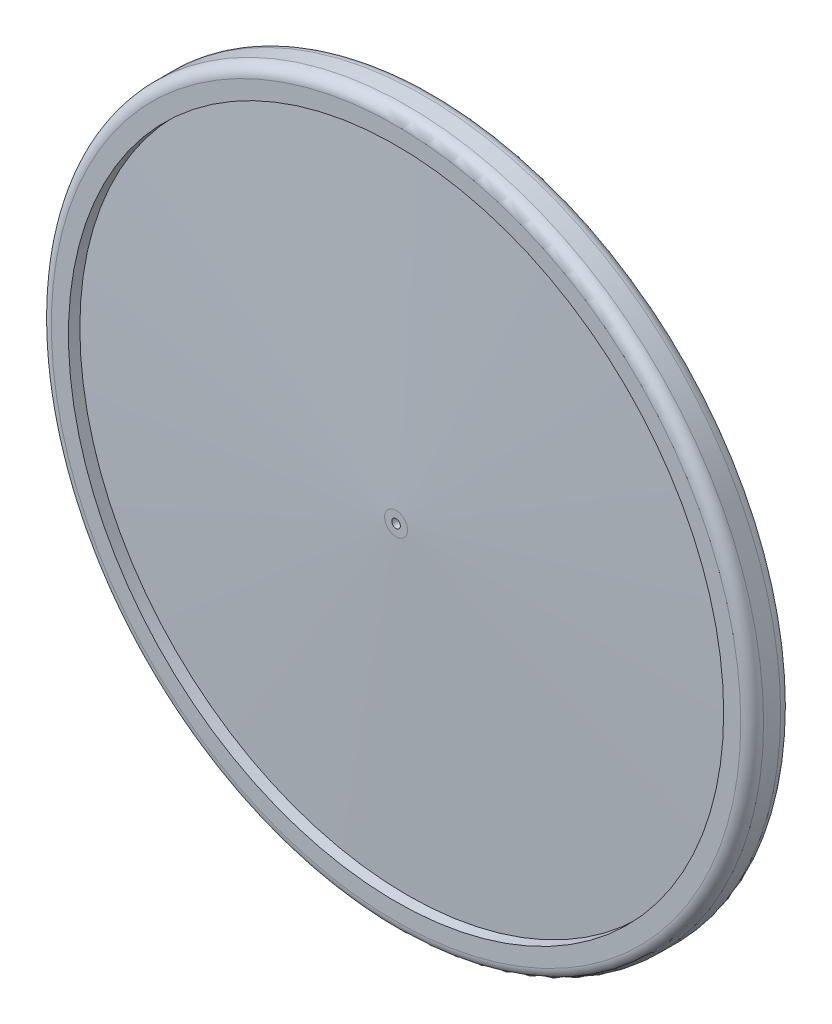
ISO-10303-21;
HEADER;
FILE_DESCRIPTION(('STEP AP214'),'2;1');
FILE_NAME('part.step','',(''),(''),'','','');
FILE_SCHEMA(('AUTOMOTIVE_DESIGN { 1 0 10303 214 1 1 1 1 }'));
ENDSEC;
DATA;
#1=APPLICATION_CONTEXT('core data for automotive mechanical design processes');
#2=APPLICATION_PROTOCOL_DEFINITION('international standard','automotive_design',2000,#1);
#3=PRODUCT_CONTEXT('',#1,'mechanical');
#4=PRODUCT('Part','Part','',(#3));
#5=PRODUCT_RELATED_PRODUCT_CATEGORY('part','',(#4));
#6=PRODUCT_DEFINITION_FORMATION('','',#4);
#7=PRODUCT_DEFINITION_CONTEXT('part definition',#1,'design');
#8=PRODUCT_DEFINITION('design','',#6,#7);
#9=PRODUCT_DEFINITION_SHAPE('','',#8);
#10=(LENGTH_UNIT() NAMED_UNIT(*) SI_UNIT(.MILLI.,.METRE.));
#11=(NAMED_UNIT(*) PLANE_ANGLE_UNIT() SI_UNIT($,.RADIAN.));
#12=(NAMED_UNIT(*) SI_UNIT($,.STERADIAN.) SOLID_ANGLE_UNIT());
#13=UNCERTAINTY_MEASURE_WITH_UNIT(LENGTH_MEASURE(1.E-05),#10,'distance_accuracy_value','');
#14=(GEOMETRIC_REPRESENTATION_CONTEXT(3) GLOBAL_UNCERTAINTY_ASSIGNED_CONTEXT((#13)) GLOBAL_UNIT_ASSIGNED_CONTEXT((#10,
#11,#12)) REPRESENTATION_CONTEXT('',''));
#15=CARTESIAN_POINT('',(0.,0.,0.));
#16=DIRECTION('',(0.,0.,1.));
#17=DIRECTION('',(1.,0.,0.));
#18=AXIS2_PLACEMENT_3D('',#15,#16,#17);
#19=CARTESIAN_POINT('',(0.,0.,17.5));
#20=DIRECTION('',(0.,0.,1.));
#21=DIRECTION('',(1.,0.,0.));
#22=AXIS2_PLACEMENT_3D('',#19,#20,#21);
#23=CYLINDRICAL_SURFACE('',#22,287.5);
#24=CARTESIAN_POINT('',(0.,0.,-7.49999999999999));
#25=DIRECTION('',(0.,0.,1.));
#26=DIRECTION('',(1.,0.,0.));
#27=AXIS2_PLACEMENT_3D('',#24,#25,#26);
#28=CIRCLE('',#27,287.5);
#29=CARTESIAN_POINT('',(287.5,0.,-7.5));
#30=VERTEX_POINT('',#29);
#31=EDGE_CURVE('E10',#30,#30,#28,.T.);
#32=ORIENTED_EDGE('',*,*,#31,.T.);
#33=EDGE_LOOP('',(#32));
#34=FACE_BOUND('',#33,.T.);
#35=CARTESIAN_POINT('',(0.,0.,-17.5));
#36=DIRECTION('',(0.,0.,1.));
#37=DIRECTION('',(1.,0.,0.));
#38=AXIS2_PLACEMENT_3D('',#35,#36,#37);
#39=CIRCLE('',#38,287.5);
#40=CARTESIAN_POINT('',(287.5,0.,-17.5));
#41=VERTEX_POINT('',#40);
#42=EDGE_CURVE('E80',#41,#41,#39,.T.);
#43=ORIENTED_EDGE('',*,*,#42,.F.);
#44=EDGE_LOOP('',(#43));
#45=FACE_BOUND('',#44,.T.);
#46=ADVANCED_FACE('F37',(#34,#45),#23,.F.);
#47=CARTESIAN_POINT('',(0.,0.,-7.49999999999999));
#48=DIRECTION('',(0.,0.,1.));
#49=DIRECTION('',(1.,0.,0.));
#50=AXIS2_PLACEMENT_3D('',#47,#48,#49);
#51=CONICAL_SURFACE('',#50,287.5,1.53477222202823);
#52=CARTESIAN_POINT('',(0.,0.,-17.5));
#53=DIRECTION('',(0.,0.,1.));
#54=DIRECTION('',(1.,0.,0.));
#55=AXIS2_PLACEMENT_3D('',#52,#53,#54);
#56=CIRCLE('',#55,10.0281820778356);
#57=CARTESIAN_POINT('',(10.0281820778348,0.,-17.5));
#58=VERTEX_POINT('',#57);
#59=EDGE_CURVE('E44',#58,#58,#56,.T.);
#60=CARTESIAN_POINT('',(10.0281820778348,0.,-17.5));
#61=CARTESIAN_POINT('',(12.9185135145241,0.,-17.3958333333333));
#62=CARTESIAN_POINT('',(15.8088449512133,0.,-17.2916666666667));
#63=CARTESIAN_POINT('',(21.5895078245917,0.,-17.0833333333333));
#64=CARTESIAN_POINT('',(24.4798392612809,0.,-16.9791666666667));
#65=CARTESIAN_POINT('',(30.2605021346594,0.,-16.7708333333333));
#66=CARTESIAN_POINT('',(33.1508335713486,0.,-16.6666666666667));
#67=CARTESIAN_POINT('',(38.931496444727,0.,-16.4583333333333));
#68=CARTESIAN_POINT('',(41.8218278814162,0.,-16.3541666666667));
#69=CARTESIAN_POINT('',(47.6024907547947,0.,-16.1458333333333));
#70=CARTESIAN_POINT('',(50.4928221914839,0.,-16.0416666666667));
#71=CARTESIAN_POINT('',(56.2734850648623,0.,-15.8333333333333));
#72=CARTESIAN_POINT('',(59.1638165015516,0.,-15.7291666666667));
#73=CARTESIAN_POINT('',(64.94447937493,0.,-15.5208333333333));
#74=CARTESIAN_POINT('',(67.8348108116192,0.,-15.4166666666667));
#75=CARTESIAN_POINT('',(73.6154736849977,0.,-15.2083333333333));
#76=CARTESIAN_POINT('',(76.5058051216869,0.,-15.1041666666667));
#77=CARTESIAN_POINT('',(82.2864679950654,0.,-14.8958333333333));
#78=CARTESIAN_POINT('',(85.1767994317546,0.,-14.7916666666667));
#79=CARTESIAN_POINT('',(90.957462305133,0.,-14.5833333333333));
#80=CARTESIAN_POINT('',(93.8477937418222,0.,-14.4791666666667));
#81=CARTESIAN_POINT('',(99.6284566152007,0.,-14.2708333333333));
#82=CARTESIAN_POINT('',(102.51878805189,0.,-14.1666666666667));
#83=CARTESIAN_POINT('',(108.299450925268,0.,-13.9583333333333));
#84=CARTESIAN_POINT('',(111.189782361958,0.,-13.8541666666667));
#85=CARTESIAN_POINT('',(116.970445235336,0.,-13.6458333333333));
#86=CARTESIAN_POINT('',(119.860776672025,0.,-13.5416666666667));
#87=CARTESIAN_POINT('',(125.641439545404,0.,-13.3333333333333));
#88=CARTESIAN_POINT('',(128.531770982093,0.,-13.2291666666667));
#89=CARTESIAN_POINT('',(134.312433855471,0.,-13.0208333333333));
#90=CARTESIAN_POINT('',(137.202765292161,0.,-12.9166666666667));
#91=CARTESIAN_POINT('',(142.983428165539,0.,-12.7083333333333));
#92=CARTESIAN_POINT('',(145.873759602228,0.,-12.6041666666667));
#93=CARTESIAN_POINT('',(151.654422475607,0.,-12.3958333333333));
#94=CARTESIAN_POINT('',(154.544753912296,0.,-12.2916666666667));
#95=CARTESIAN_POINT('',(160.325416785674,0.,-12.0833333333333));
#96=CARTESIAN_POINT('',(163.215748222364,0.,-11.9791666666667));
#97=CARTESIAN_POINT('',(168.996411095742,0.,-11.7708333333333));
#98=CARTESIAN_POINT('',(171.886742532431,0.,-11.6666666666667));
#99=CARTESIAN_POINT('',(177.66740540581,0.,-11.4583333333333));
#100=CARTESIAN_POINT('',(180.557736842499,0.,-11.3541666666667));
#101=CARTESIAN_POINT('',(186.338399715877,0.,-11.1458333333333));
#102=CARTESIAN_POINT('',(189.228731152566,0.,-11.0416666666667));
#103=CARTESIAN_POINT('',(195.009394025945,0.,-10.8333333333333));
#104=CARTESIAN_POINT('',(197.899725462634,0.,-10.7291666666667));
#105=CARTESIAN_POINT('',(203.680388336013,0.,-10.5208333333333));
#106=CARTESIAN_POINT('',(206.570719772702,0.,-10.4166666666667));
#107=CARTESIAN_POINT('',(212.35138264608,0.,-10.2083333333333));
#108=CARTESIAN_POINT('',(215.241714082769,0.,-10.1041666666667));
#109=CARTESIAN_POINT('',(221.022376956148,0.,-9.89583333333333));
#110=CARTESIAN_POINT('',(223.912708392837,0.,-9.79166666666667));
#111=CARTESIAN_POINT('',(229.693371266216,0.,-9.58333333333333));
#112=CARTESIAN_POINT('',(232.583702702905,0.,-9.47916666666667));
#113=CARTESIAN_POINT('',(238.364365576283,0.,-9.27083333333333));
#114=CARTESIAN_POINT('',(241.254697012972,0.,-9.16666666666667));
#115=CARTESIAN_POINT('',(247.035359886351,0.,-8.95833333333334));
#116=CARTESIAN_POINT('',(249.92569132304,0.,-8.85416666666667));
#117=CARTESIAN_POINT('',(255.706354196419,0.,-8.64583333333334));
#118=CARTESIAN_POINT('',(258.596685633108,0.,-8.54166666666667));
#119=CARTESIAN_POINT('',(264.377348506486,0.,-8.33333333333334));
#120=CARTESIAN_POINT('',(267.267679943175,0.,-8.22916666666667));
#121=CARTESIAN_POINT('',(273.048342816554,0.,-8.02083333333334));
#122=CARTESIAN_POINT('',(275.938674253243,0.,-7.91666666666667));
#123=CARTESIAN_POINT('',(281.719337126621,0.,-7.70833333333334));
#124=CARTESIAN_POINT('',(284.609668563311,0.,-7.60416666666667));
#125=CARTESIAN_POINT('',(287.5,0.,-7.5));
#126=B_SPLINE_CURVE_WITH_KNOTS('',3,(#60,#61,#62,#63,#64,#65,#66,#67,#68,#69,#70,#71,#72,#73,
#74,#75,#76,#77,#78,#79,#80,#81,#82,#83,#84,#85,#86,#87,#88,#89,#90,#91,#92,#93,#94,#95,#96,#97,
#98,#99,#100,#101,#102,#103,#104,#105,#106,#107,#108,#109,#110,#111,#112,#113,#114,#115,#116,
#117,#118,#119,#120,#121,#122,#123,#124,#125),.UNSPECIFIED.,.F.,.F.,(4,2,2,2,2,2,2,2,2,2,2,2,2,
2,2,2,2,2,2,2,2,2,2,2,2,2,2,2,2,2,2,2,4),(0.,8.67662368523755,17.3532473704751,26.0298710557127,
34.7064947409503,43.3831184261879,52.0597421114254,60.736365796663,69.4129894819006,
78.0896131671382,86.7662368523758,95.4428605376134,104.119484222851,112.796107908089,
121.472731593326,130.149355278564,138.825978963801,147.502602649039,156.179226334276,
164.855850019514,173.532473704752,182.209097389989,190.885721075227,199.562344760464,
208.238968445702,216.91559213094,225.592215816177,234.268839501415,242.945463186652,
251.62208687189,260.298710557127,268.975334242365,277.651957927603),.UNSPECIFIED.);
#127=EDGE_CURVE('BSEAM114',#58,#30,#126,.T.);
#128=ORIENTED_EDGE('',*,*,#59,.T.);
#129=ORIENTED_EDGE('',*,*,#31,.F.);
#130=ORIENTED_EDGE('',*,*,#127,.T.);
#131=ORIENTED_EDGE('',*,*,#127,.F.);
#132=EDGE_LOOP('',(#128,#130,#129,#131));
#133=FACE_BOUND('',#132,.T.);
#134=ADVANCED_FACE('F114',(#133),#51,.T.);
#135=CARTESIAN_POINT('',(0.,0.,-17.5));
#136=DIRECTION('',(0.,0.,-1.));
#137=DIRECTION('',(-1.,0.,0.));
#138=AXIS2_PLACEMENT_3D('',#135,#136,#137);
#139=PLANE('',#138);
#140=CARTESIAN_POINT('',(0.,0.,-17.5));
#141=DIRECTION('',(0.,0.,-1.));
#142=DIRECTION('',(-1.,0.,0.));
#143=AXIS2_PLACEMENT_3D('',#140,#141,#142);
#144=CIRCLE('',#143,3.75);
#145=CARTESIAN_POINT('',(-3.75,0.,-17.5));
#146=VERTEX_POINT('',#145);
#147=EDGE_CURVE('E84',#146,#146,#144,.T.);
#148=ORIENTED_EDGE('',*,*,#147,.F.);
#149=EDGE_LOOP('',(#148));
#150=FACE_BOUND('',#149,.T.);
#151=ORIENTED_EDGE('',*,*,#59,.F.);
#152=EDGE_LOOP('',(#151));
#153=FACE_BOUND('',#152,.T.);
#154=ADVANCED_FACE('F99',(#150,#153),#139,.T.);
#155=CARTESIAN_POINT('',(10.0281820778356,0.,17.5));
#156=DIRECTION('',(0.,0.,1.));
#157=DIRECTION('',(1.,0.,0.));
#158=AXIS2_PLACEMENT_3D('',#155,#156,#157);
#159=PLANE('',#158);
#160=CARTESIAN_POINT('',(0.,0.,17.5));
#161=DIRECTION('',(0.,0.,1.));
#162=DIRECTION('',(1.,0.,0.));
#163=AXIS2_PLACEMENT_3D('',#160,#161,#162);
#164=CIRCLE('',#163,3.75);
#165=CARTESIAN_POINT('',(3.75,0.,17.5));
#166=VERTEX_POINT('',#165);
#167=EDGE_CURVE('E88',#166,#166,#164,.T.);
#168=ORIENTED_EDGE('',*,*,#167,.F.);
#169=EDGE_LOOP('',(#168));
#170=FACE_BOUND('',#169,.T.);
#171=CARTESIAN_POINT('',(0.,0.,17.5));
#172=DIRECTION('',(0.,0.,1.));
#173=DIRECTION('',(1.,0.,0.));
#174=AXIS2_PLACEMENT_3D('',#171,#172,#173);
#175=CIRCLE('',#174,10.0281820778356);
#176=CARTESIAN_POINT('',(-10.0281820778356,0.,17.5));
#177=VERTEX_POINT('',#176);
#178=EDGE_CURVE('E49',#177,#177,#175,.T.);
#179=ORIENTED_EDGE('',*,*,#178,.T.);
#180=EDGE_LOOP('',(#179));
#181=FACE_BOUND('',#180,.T.);
#182=ADVANCED_FACE('F95',(#170,#181),#159,.T.);
#183=CARTESIAN_POINT('',(0.,0.,17.5));
#184=DIRECTION('',(0.,0.,-1.));
#185=DIRECTION('',(-1.,0.,0.));
#186=AXIS2_PLACEMENT_3D('',#183,#184,#185);
#187=CONICAL_SURFACE('',#186,10.0281820778356,1.53477222202823);
#188=CARTESIAN_POINT('',(0.,0.,7.50000000000002));
#189=DIRECTION('',(0.,0.,1.));
#190=DIRECTION('',(1.,0.,0.));
#191=AXIS2_PLACEMENT_3D('',#188,#189,#190);
#192=CIRCLE('',#191,287.5);
#193=CARTESIAN_POINT('',(-287.5,0.,7.50000000000003));
#194=VERTEX_POINT('',#193);
#195=EDGE_CURVE('E54',#194,#194,#192,.T.);
#196=CARTESIAN_POINT('',(-287.5,0.,7.50000000000003));
#197=CARTESIAN_POINT('',(-284.609668563311,0.,7.6041666666667));
#198=CARTESIAN_POINT('',(-281.719337126622,0.,7.70833333333337));
#199=CARTESIAN_POINT('',(-275.938674253243,0.,7.9166666666667));
#200=CARTESIAN_POINT('',(-273.048342816554,0.,8.02083333333336));
#201=CARTESIAN_POINT('',(-267.267679943175,0.,8.2291666666667));
#202=CARTESIAN_POINT('',(-264.377348506486,0.,8.33333333333336));
#203=CARTESIAN_POINT('',(-258.596685633108,0.,8.5416666666667));
#204=CARTESIAN_POINT('',(-255.706354196419,0.,8.64583333333336));
#205=CARTESIAN_POINT('',(-249.92569132304,0.,8.85416666666669));
#206=CARTESIAN_POINT('',(-247.035359886351,0.,8.95833333333336));
#207=CARTESIAN_POINT('',(-241.254697012973,0.,9.16666666666669));
#208=CARTESIAN_POINT('',(-238.364365576283,0.,9.27083333333336));
#209=CARTESIAN_POINT('',(-232.583702702905,0.,9.47916666666669));
#210=CARTESIAN_POINT('',(-229.693371266216,0.,9.58333333333336));
#211=CARTESIAN_POINT('',(-223.912708392837,0.,9.79166666666669));
#212=CARTESIAN_POINT('',(-221.022376956148,0.,9.89583333333336));
#213=CARTESIAN_POINT('',(-215.24171408277,0.,10.1041666666667));
#214=CARTESIAN_POINT('',(-212.35138264608,0.,10.2083333333334));
#215=CARTESIAN_POINT('',(-206.570719772702,0.,10.4166666666667));
#216=CARTESIAN_POINT('',(-203.680388336013,0.,10.5208333333334));
#217=CARTESIAN_POINT('',(-197.899725462634,0.,10.7291666666667));
#218=CARTESIAN_POINT('',(-195.009394025945,0.,10.8333333333334));
#219=CARTESIAN_POINT('',(-189.228731152567,0.,11.0416666666667));
#220=CARTESIAN_POINT('',(-186.338399715878,0.,11.1458333333334));
#221=CARTESIAN_POINT('',(-180.557736842499,0.,11.3541666666667));
#222=CARTESIAN_POINT('',(-177.66740540581,0.,11.4583333333334));
#223=CARTESIAN_POINT('',(-171.886742532431,0.,11.6666666666667));
#224=CARTESIAN_POINT('',(-168.996411095742,0.,11.7708333333333));
#225=CARTESIAN_POINT('',(-163.215748222364,0.,11.9791666666667));
#226=CARTESIAN_POINT('',(-160.325416785675,0.,12.0833333333333));
#227=CARTESIAN_POINT('',(-154.544753912296,0.,12.2916666666667));
#228=CARTESIAN_POINT('',(-151.654422475607,0.,12.3958333333334));
#229=CARTESIAN_POINT('',(-145.873759602229,0.,12.6041666666667));
#230=CARTESIAN_POINT('',(-142.983428165539,0.,12.7083333333334));
#231=CARTESIAN_POINT('',(-137.202765292161,0.,12.9166666666667));
#232=CARTESIAN_POINT('',(-134.312433855472,0.,13.0208333333333));
#233=CARTESIAN_POINT('',(-128.531770982093,0.,13.2291666666667));
#234=CARTESIAN_POINT('',(-125.641439545404,0.,13.3333333333333));
#235=CARTESIAN_POINT('',(-119.860776672026,0.,13.5416666666667));
#236=CARTESIAN_POINT('',(-116.970445235336,0.,13.6458333333333));
#237=CARTESIAN_POINT('',(-111.189782361958,0.,13.8541666666667));
#238=CARTESIAN_POINT('',(-108.299450925269,0.,13.9583333333333));
#239=CARTESIAN_POINT('',(-102.51878805189,0.,14.1666666666667));
#240=CARTESIAN_POINT('',(-99.6284566152012,0.,14.2708333333333));
#241=CARTESIAN_POINT('',(-93.8477937418228,0.,14.4791666666667));
#242=CARTESIAN_POINT('',(-90.9574623051335,0.,14.5833333333333));
#243=CARTESIAN_POINT('',(-85.1767994317551,0.,14.7916666666667));
#244=CARTESIAN_POINT('',(-82.2864679950659,0.,14.8958333333333));
#245=CARTESIAN_POINT('',(-76.5058051216875,0.,15.1041666666667));
#246=CARTESIAN_POINT('',(-73.6154736849982,0.,15.2083333333333));
#247=CARTESIAN_POINT('',(-67.8348108116198,0.,15.4166666666667));
#248=CARTESIAN_POINT('',(-64.9444793749306,0.,15.5208333333333));
#249=CARTESIAN_POINT('',(-59.1638165015522,0.,15.7291666666667));
#250=CARTESIAN_POINT('',(-56.273485064863,0.,15.8333333333333));
#251=CARTESIAN_POINT('',(-50.4928221914845,0.,16.0416666666667));
#252=CARTESIAN_POINT('',(-47.6024907547953,0.,16.1458333333333));
#253=CARTESIAN_POINT('',(-41.8218278814169,0.,16.3541666666667));
#254=CARTESIAN_POINT('',(-38.9314964447277,0.,16.4583333333333));
#255=CARTESIAN_POINT('',(-33.1508335713493,0.,16.6666666666667));
#256=CARTESIAN_POINT('',(-30.2605021346601,0.,16.7708333333333));
#257=CARTESIAN_POINT('',(-24.4798392612816,0.,16.9791666666667));
#258=CARTESIAN_POINT('',(-21.5895078245924,0.,17.0833333333333));
#259=CARTESIAN_POINT('',(-15.808844951214,0.,17.2916666666667));
#260=CARTESIAN_POINT('',(-12.9185135145248,0.,17.3958333333333));
#261=CARTESIAN_POINT('',(-10.0281820778356,0.,17.5));
#262=B_SPLINE_CURVE_WITH_KNOTS('',3,(#196,#197,#198,#199,#200,#201,#202,#203,#204,#205,#206,
#207,#208,#209,#210,#211,#212,#213,#214,#215,#216,#217,#218,#219,#220,#221,#222,#223,#224,#225,
#226,#227,#228,#229,#230,#231,#232,#233,#234,#235,#236,#237,#238,#239,#240,#241,#242,#243,#244,
#245,#246,#247,#248,#249,#250,#251,#252,#253,#254,#255,#256,#257,#258,#259,#260,#261),
.UNSPECIFIED.,.F.,.F.,(4,2,2,2,2,2,2,2,2,2,2,2,2,2,2,2,2,2,2,2,2,2,2,2,2,2,2,2,2,2,2,2,4),(0.,
8.67662368523754,17.3532473704751,26.0298710557126,34.7064947409502,43.3831184261878,
52.0597421114253,60.7363657966629,69.4129894819004,78.089613167138,86.7662368523755,
95.4428605376131,104.119484222851,112.796107908088,121.472731593326,130.149355278563,
138.825978963801,147.502602649038,156.179226334276,164.855850019514,173.532473704751,
182.209097389989,190.885721075226,199.562344760464,208.238968445701,216.915592130939,
225.592215816176,234.268839501414,242.945463186652,251.622086871889,260.298710557127,
268.975334242364,277.651957927602),.UNSPECIFIED.);
#263=EDGE_CURVE('BSEAM98',#194,#177,#262,.T.);
#264=ORIENTED_EDGE('',*,*,#195,.T.);
#265=ORIENTED_EDGE('',*,*,#178,.F.);
#266=ORIENTED_EDGE('',*,*,#263,.T.);
#267=ORIENTED_EDGE('',*,*,#263,.F.);
#268=EDGE_LOOP('',(#264,#266,#265,#267));
#269=FACE_BOUND('',#268,.T.);
#270=ADVANCED_FACE('F98',(#269),#187,.T.);
#271=CARTESIAN_POINT('',(0.,0.,17.5));
#272=DIRECTION('',(0.,0.,1.));
#273=DIRECTION('',(1.,0.,0.));
#274=AXIS2_PLACEMENT_3D('',#271,#272,#273);
#275=CYLINDRICAL_SURFACE('',#274,287.5);
#276=CARTESIAN_POINT('',(0.,0.,17.5));
#277=DIRECTION('',(0.,0.,1.));
#278=DIRECTION('',(1.,0.,0.));
#279=AXIS2_PLACEMENT_3D('',#276,#277,#278);
#280=CIRCLE('',#279,287.5);
#281=CARTESIAN_POINT('',(287.5,0.,17.5));
#282=VERTEX_POINT('',#281);
#283=EDGE_CURVE('E60',#282,#282,#280,.T.);
#284=ORIENTED_EDGE('',*,*,#283,.T.);
#285=EDGE_LOOP('',(#284));
#286=FACE_BOUND('',#285,.T.);
#287=ORIENTED_EDGE('',*,*,#195,.F.);
#288=EDGE_LOOP('',(#287));
#289=FACE_BOUND('',#288,.T.);
#290=ADVANCED_FACE('F104',(#286,#289),#275,.F.);
#291=CARTESIAN_POINT('',(287.5,0.,17.5));
#292=DIRECTION('',(0.,0.,1.));
#293=DIRECTION('',(1.,0.,0.));
#294=AXIS2_PLACEMENT_3D('',#291,#292,#293);
#295=PLANE('',#294);
#296=CARTESIAN_POINT('',(0.,0.,17.5));
#297=DIRECTION('',(0.,0.,1.));
#298=DIRECTION('',(1.,0.,0.));
#299=AXIS2_PLACEMENT_3D('',#296,#297,#298);
#300=CIRCLE('',#299,302.5);
#301=CARTESIAN_POINT('',(302.5,0.,17.5));
#302=VERTEX_POINT('',#301);
#303=EDGE_CURVE('E64',#302,#302,#300,.T.);
#304=ORIENTED_EDGE('',*,*,#303,.T.);
#305=EDGE_LOOP('',(#304));
#306=FACE_BOUND('',#305,.T.);
#307=ORIENTED_EDGE('',*,*,#283,.F.);
#308=EDGE_LOOP('',(#307));
#309=FACE_BOUND('',#308,.T.);
#310=ADVANCED_FACE('F110',(#306,#309),#295,.T.);
#311=CARTESIAN_POINT('',(0.,0.,7.50000000000002));
#312=DIRECTION('',(0.,0.,1.));
#313=DIRECTION('',(1.,0.,0.));
#314=AXIS2_PLACEMENT_3D('',#311,#312,#313);
#315=TOROIDAL_SURFACE('',#314,302.5,10.);
#316=CARTESIAN_POINT('',(0.,0.,7.50000000000002));
#317=DIRECTION('',(0.,0.,1.));
#318=DIRECTION('',(1.,0.,0.));
#319=AXIS2_PLACEMENT_3D('',#316,#317,#318);
#320=CIRCLE('',#319,312.5);
#321=CARTESIAN_POINT('',(312.5,0.,7.5));
#322=VERTEX_POINT('',#321);
#323=EDGE_CURVE('E68',#322,#322,#320,.T.);
#324=ORIENTED_EDGE('',*,*,#323,.T.);
#325=EDGE_LOOP('',(#324));
#326=FACE_BOUND('',#325,.T.);
#327=ORIENTED_EDGE('',*,*,#303,.F.);
#328=EDGE_LOOP('',(#327));
#329=FACE_BOUND('',#328,.T.);
#330=ADVANCED_FACE('F136',(#326,#329),#315,.T.);
#331=CARTESIAN_POINT('',(0.,0.,17.5));
#332=DIRECTION('',(0.,0.,1.));
#333=DIRECTION('',(1.,0.,0.));
#334=AXIS2_PLACEMENT_3D('',#331,#332,#333);
#335=CYLINDRICAL_SURFACE('',#334,312.5);
#336=CARTESIAN_POINT('',(0.,0.,-7.49999999999999));
#337=DIRECTION('',(0.,0.,1.));
#338=DIRECTION('',(1.,0.,0.));
#339=AXIS2_PLACEMENT_3D('',#336,#337,#338);
#340=CIRCLE('',#339,312.5);
#341=CARTESIAN_POINT('',(312.5,0.,-7.50000000000001));
#342=VERTEX_POINT('',#341);
#343=EDGE_CURVE('E72',#342,#342,#340,.T.);
#344=ORIENTED_EDGE('',*,*,#343,.T.);
#345=EDGE_LOOP('',(#344));
#346=FACE_BOUND('',#345,.T.);
#347=ORIENTED_EDGE('',*,*,#323,.F.);
#348=EDGE_LOOP('',(#347));
#349=FACE_BOUND('',#348,.T.);
#350=ADVANCED_FACE('F130',(#346,#349),#335,.T.);
#351=CARTESIAN_POINT('',(0.,0.,-7.49999999999999));
#352=DIRECTION('',(0.,0.,1.));
#353=DIRECTION('',(1.,0.,0.));
#354=AXIS2_PLACEMENT_3D('',#351,#352,#353);
#355=TOROIDAL_SURFACE('',#354,302.5,10.);
#356=CARTESIAN_POINT('',(0.,0.,-17.5));
#357=DIRECTION('',(0.,0.,1.));
#358=DIRECTION('',(1.,0.,0.));
#359=AXIS2_PLACEMENT_3D('',#356,#357,#358);
#360=CIRCLE('',#359,302.5);
#361=CARTESIAN_POINT('',(302.5,0.,-17.5));
#362=VERTEX_POINT('',#361);
#363=EDGE_CURVE('E76',#362,#362,#360,.T.);
#364=ORIENTED_EDGE('',*,*,#363,.T.);
#365=EDGE_LOOP('',(#364));
#366=FACE_BOUND('',#365,.T.);
#367=ORIENTED_EDGE('',*,*,#343,.F.);
#368=EDGE_LOOP('',(#367));
#369=FACE_BOUND('',#368,.T.);
#370=ADVANCED_FACE('F124',(#366,#369),#355,.T.);
#371=CARTESIAN_POINT('',(287.5,0.,-17.5));
#372=DIRECTION('',(0.,0.,-1.));
#373=DIRECTION('',(-1.,0.,0.));
#374=AXIS2_PLACEMENT_3D('',#371,#372,#373);
#375=PLANE('',#374);
#376=ORIENTED_EDGE('',*,*,#42,.T.);
#377=EDGE_LOOP('',(#376));
#378=FACE_BOUND('',#377,.T.);
#379=ORIENTED_EDGE('',*,*,#363,.F.);
#380=EDGE_LOOP('',(#379));
#381=FACE_BOUND('',#380,.T.);
#382=ADVANCED_FACE('F121',(#378,#381),#375,.T.);
#383=CARTESIAN_POINT('',(0.,0.,-54.5));
#384=DIRECTION('',(0.,0.,1.));
#385=DIRECTION('',(1.,0.,0.));
#386=AXIS2_PLACEMENT_3D('',#383,#384,#385);
#387=CYLINDRICAL_SURFACE('',#386,3.75);
#388=ORIENTED_EDGE('',*,*,#147,.T.);
#389=EDGE_LOOP('',(#388));
#390=FACE_BOUND('',#389,.T.);
#391=ORIENTED_EDGE('',*,*,#167,.T.);
#392=EDGE_LOOP('',(#391));
#393=FACE_BOUND('',#392,.T.);
#394=ADVANCED_FACE('F93',(#390,#393),#387,.F.);
#395=CLOSED_SHELL('',(#46,#134,#154,#182,#270,#290,#310,#330,#350,#370,#382,#394));
#396=MANIFOLD_SOLID_BREP('B2',#395);
#397=ADVANCED_BREP_SHAPE_REPRESENTATION('',(#18,#396),#14);
#398=SHAPE_DEFINITION_REPRESENTATION(#9,#397);
ENDSEC;
END-ISO-10303-21;
